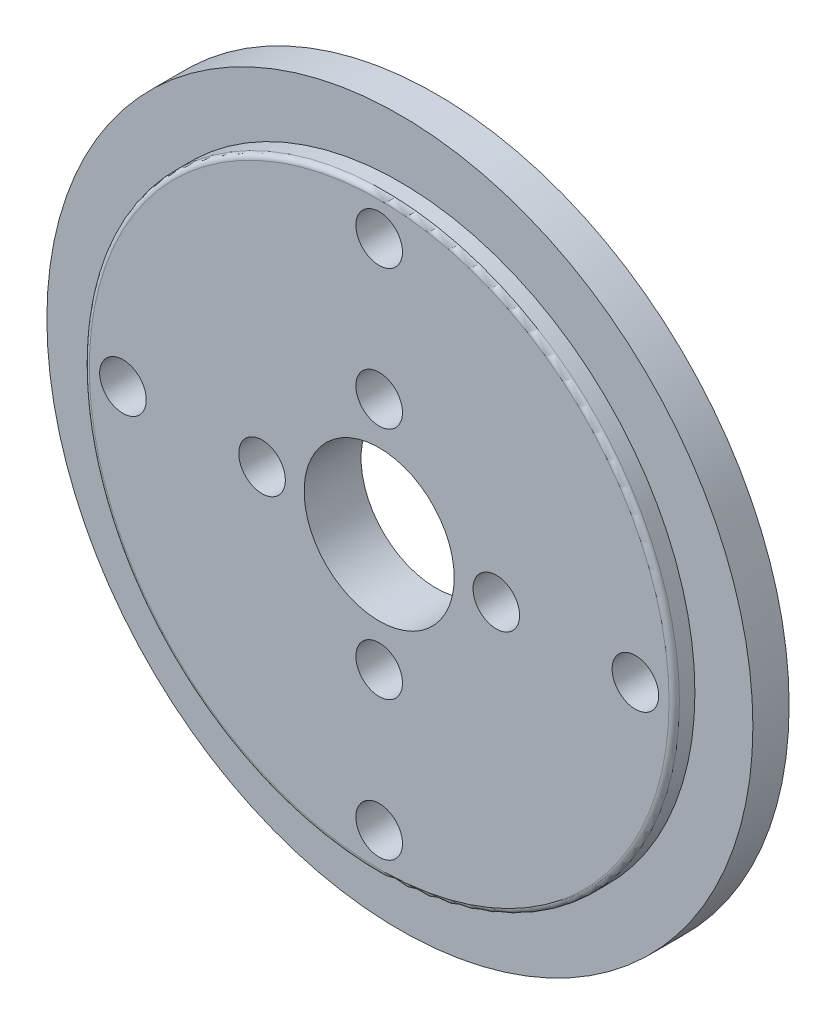
ISO-10303-21;
HEADER;
FILE_DESCRIPTION(('STEP AP214'),'2;1');
FILE_NAME('part.step','',(''),(''),'','','');
FILE_SCHEMA(('AUTOMOTIVE_DESIGN { 1 0 10303 214 1 1 1 1 }'));
ENDSEC;
DATA;
#1=APPLICATION_CONTEXT('core data for automotive mechanical design processes');
#2=APPLICATION_PROTOCOL_DEFINITION('international standard','automotive_design',2000,#1);
#3=PRODUCT_CONTEXT('',#1,'mechanical');
#4=PRODUCT('Part','Part','',(#3));
#5=PRODUCT_RELATED_PRODUCT_CATEGORY('part','',(#4));
#6=PRODUCT_DEFINITION_FORMATION('','',#4);
#7=PRODUCT_DEFINITION_CONTEXT('part definition',#1,'design');
#8=PRODUCT_DEFINITION('design','',#6,#7);
#9=PRODUCT_DEFINITION_SHAPE('','',#8);
#10=(LENGTH_UNIT() NAMED_UNIT(*) SI_UNIT(.MILLI.,.METRE.));
#11=(NAMED_UNIT(*) PLANE_ANGLE_UNIT() SI_UNIT($,.RADIAN.));
#12=(NAMED_UNIT(*) SI_UNIT($,.STERADIAN.) SOLID_ANGLE_UNIT());
#13=UNCERTAINTY_MEASURE_WITH_UNIT(LENGTH_MEASURE(1.E-05),#10,'distance_accuracy_value','');
#14=(GEOMETRIC_REPRESENTATION_CONTEXT(3) GLOBAL_UNCERTAINTY_ASSIGNED_CONTEXT((#13)) GLOBAL_UNIT_ASSIGNED_CONTEXT((#10,
#11,#12)) REPRESENTATION_CONTEXT('',''));
#15=CARTESIAN_POINT('',(0.,0.,0.));
#16=DIRECTION('',(0.,0.,1.));
#17=DIRECTION('',(1.,0.,0.));
#18=AXIS2_PLACEMENT_3D('',#15,#16,#17);
#19=CARTESIAN_POINT('',(0.,0.,1.75));
#20=DIRECTION('',(0.,0.,-1.));
#21=DIRECTION('',(-1.,0.,0.));
#22=AXIS2_PLACEMENT_3D('',#19,#20,#21);
#23=CYLINDRICAL_SURFACE('',#22,34.1);
#24=CARTESIAN_POINT('',(0.,0.,1.75));
#25=DIRECTION('',(0.,0.,1.));
#26=DIRECTION('',(1.,0.,0.));
#27=AXIS2_PLACEMENT_3D('',#24,#25,#26);
#28=CIRCLE('',#27,34.1);
#29=CARTESIAN_POINT('',(34.1,0.,1.75));
#30=VERTEX_POINT('',#29);
#31=EDGE_CURVE('E54',#30,#30,#28,.T.);
#32=ORIENTED_EDGE('',*,*,#31,.F.);
#33=EDGE_LOOP('',(#32));
#34=FACE_BOUND('',#33,.T.);
#35=CARTESIAN_POINT('',(0.,0.,-1.75));
#36=DIRECTION('',(0.,0.,1.));
#37=DIRECTION('',(1.,0.,0.));
#38=AXIS2_PLACEMENT_3D('',#35,#36,#37);
#39=CIRCLE('',#38,34.1);
#40=CARTESIAN_POINT('',(34.1,0.,-1.75));
#41=VERTEX_POINT('',#40);
#42=EDGE_CURVE('E57',#41,#41,#39,.T.);
#43=ORIENTED_EDGE('',*,*,#42,.T.);
#44=EDGE_LOOP('',(#43));
#45=FACE_BOUND('',#44,.T.);
#46=ADVANCED_FACE('F39',(#34,#45),#23,.T.);
#47=CARTESIAN_POINT('',(0.,0.,1.75));
#48=DIRECTION('',(0.,0.,1.));
#49=DIRECTION('',(1.,0.,0.));
#50=AXIS2_PLACEMENT_3D('',#47,#48,#49);
#51=PLANE('',#50);
#52=CARTESIAN_POINT('',(0.,0.,1.75));
#53=DIRECTION('',(0.,0.,1.));
#54=DIRECTION('',(1.,0.,0.));
#55=AXIS2_PLACEMENT_3D('',#52,#53,#54);
#56=CIRCLE('',#55,28.5);
#57=CARTESIAN_POINT('',(28.5,0.,1.75));
#58=VERTEX_POINT('',#57);
#59=EDGE_CURVE('E50',#58,#58,#56,.T.);
#60=ORIENTED_EDGE('',*,*,#59,.F.);
#61=EDGE_LOOP('',(#60));
#62=FACE_BOUND('',#61,.T.);
#63=ORIENTED_EDGE('',*,*,#31,.T.);
#64=EDGE_LOOP('',(#63));
#65=FACE_BOUND('',#64,.T.);
#66=ADVANCED_FACE('F136',(#62,#65),#51,.T.);
#67=CARTESIAN_POINT('',(0.,0.,-1.75));
#68=DIRECTION('',(0.,0.,1.));
#69=DIRECTION('',(1.,0.,0.));
#70=AXIS2_PLACEMENT_3D('',#67,#68,#69);
#71=PLANE('',#70);
#72=CARTESIAN_POINT('',(0.,0.,-1.75));
#73=DIRECTION('',(0.,0.,1.));
#74=DIRECTION('',(1.,0.,0.));
#75=AXIS2_PLACEMENT_3D('',#72,#73,#74);
#76=CIRCLE('',#75,7.25);
#77=CARTESIAN_POINT('',(7.25,0.,-1.75));
#78=VERTEX_POINT('',#77);
#79=EDGE_CURVE('E113',#78,#78,#76,.T.);
#80=ORIENTED_EDGE('',*,*,#79,.T.);
#81=EDGE_LOOP('',(#80));
#82=FACE_BOUND('',#81,.T.);
#83=CARTESIAN_POINT('',(0.,24.75,-1.75));
#84=DIRECTION('',(0.,0.,1.));
#85=DIRECTION('',(1.,0.,0.));
#86=AXIS2_PLACEMENT_3D('',#83,#84,#85);
#87=CIRCLE('',#86,2.25);
#88=CARTESIAN_POINT('',(2.25,24.75,-1.75));
#89=VERTEX_POINT('',#88);
#90=EDGE_CURVE('E60',#89,#89,#87,.T.);
#91=ORIENTED_EDGE('',*,*,#90,.T.);
#92=EDGE_LOOP('',(#91));
#93=FACE_BOUND('',#92,.T.);
#94=CARTESIAN_POINT('',(0.,-11.3137085,-1.75));
#95=DIRECTION('',(0.,0.,1.));
#96=DIRECTION('',(1.,0.,0.));
#97=AXIS2_PLACEMENT_3D('',#94,#95,#96);
#98=CIRCLE('',#97,2.25);
#99=CARTESIAN_POINT('',(2.25,-11.3137085,-1.75));
#100=VERTEX_POINT('',#99);
#101=EDGE_CURVE('E92',#100,#100,#98,.T.);
#102=ORIENTED_EDGE('',*,*,#101,.T.);
#103=EDGE_LOOP('',(#102));
#104=FACE_BOUND('',#103,.T.);
#105=CARTESIAN_POINT('',(-24.75,0.,-1.75));
#106=DIRECTION('',(0.,0.,1.));
#107=DIRECTION('',(1.,0.,0.));
#108=AXIS2_PLACEMENT_3D('',#105,#106,#107);
#109=CIRCLE('',#108,2.25);
#110=CARTESIAN_POINT('',(-22.5,0.,-1.75));
#111=VERTEX_POINT('',#110);
#112=EDGE_CURVE('E93',#111,#111,#109,.T.);
#113=ORIENTED_EDGE('',*,*,#112,.T.);
#114=EDGE_LOOP('',(#113));
#115=FACE_BOUND('',#114,.T.);
#116=CARTESIAN_POINT('',(-11.3137085,0.,-1.75));
#117=DIRECTION('',(0.,0.,1.));
#118=DIRECTION('',(1.,0.,0.));
#119=AXIS2_PLACEMENT_3D('',#116,#117,#118);
#120=CIRCLE('',#119,2.25);
#121=CARTESIAN_POINT('',(-9.0637085,0.,-1.75));
#122=VERTEX_POINT('',#121);
#123=EDGE_CURVE('E103',#122,#122,#120,.T.);
#124=ORIENTED_EDGE('',*,*,#123,.T.);
#125=EDGE_LOOP('',(#124));
#126=FACE_BOUND('',#125,.T.);
#127=CARTESIAN_POINT('',(0.,11.3137085,-1.75));
#128=DIRECTION('',(0.,0.,1.));
#129=DIRECTION('',(1.,0.,0.));
#130=AXIS2_PLACEMENT_3D('',#127,#128,#129);
#131=CIRCLE('',#130,2.25);
#132=CARTESIAN_POINT('',(2.25,11.3137085,-1.75));
#133=VERTEX_POINT('',#132);
#134=EDGE_CURVE('E66',#133,#133,#131,.T.);
#135=ORIENTED_EDGE('',*,*,#134,.T.);
#136=EDGE_LOOP('',(#135));
#137=FACE_BOUND('',#136,.T.);
#138=CARTESIAN_POINT('',(24.75,0.,-1.75));
#139=DIRECTION('',(0.,0.,1.));
#140=DIRECTION('',(1.,0.,0.));
#141=AXIS2_PLACEMENT_3D('',#138,#139,#140);
#142=CIRCLE('',#141,2.25);
#143=CARTESIAN_POINT('',(27.,0.,-1.75));
#144=VERTEX_POINT('',#143);
#145=EDGE_CURVE('E67',#144,#144,#142,.T.);
#146=ORIENTED_EDGE('',*,*,#145,.T.);
#147=EDGE_LOOP('',(#146));
#148=FACE_BOUND('',#147,.T.);
#149=CARTESIAN_POINT('',(11.3137085,0.,-1.75));
#150=DIRECTION('',(0.,0.,1.));
#151=DIRECTION('',(1.,0.,0.));
#152=AXIS2_PLACEMENT_3D('',#149,#150,#151);
#153=CIRCLE('',#152,2.25);
#154=CARTESIAN_POINT('',(13.5637085,0.,-1.75));
#155=VERTEX_POINT('',#154);
#156=EDGE_CURVE('E80',#155,#155,#153,.T.);
#157=ORIENTED_EDGE('',*,*,#156,.T.);
#158=EDGE_LOOP('',(#157));
#159=FACE_BOUND('',#158,.T.);
#160=CARTESIAN_POINT('',(0.,-24.75,-1.75));
#161=DIRECTION('',(0.,0.,1.));
#162=DIRECTION('',(1.,0.,0.));
#163=AXIS2_PLACEMENT_3D('',#160,#161,#162);
#164=CIRCLE('',#163,2.25);
#165=CARTESIAN_POINT('',(2.25,-24.75,-1.75));
#166=VERTEX_POINT('',#165);
#167=EDGE_CURVE('E81',#166,#166,#164,.T.);
#168=ORIENTED_EDGE('',*,*,#167,.T.);
#169=EDGE_LOOP('',(#168));
#170=FACE_BOUND('',#169,.T.);
#171=ORIENTED_EDGE('',*,*,#42,.F.);
#172=EDGE_LOOP('',(#171));
#173=FACE_BOUND('',#172,.T.);
#174=ADVANCED_FACE('F117',(#82,#93,#104,#115,#126,#137,#148,#159,#170,#173),#71,.F.);
#175=CARTESIAN_POINT('',(0.,0.,3.75));
#176=DIRECTION('',(0.,0.,-1.));
#177=DIRECTION('',(-1.,0.,0.));
#178=AXIS2_PLACEMENT_3D('',#175,#176,#177);
#179=CYLINDRICAL_SURFACE('',#178,28.5);
#180=CARTESIAN_POINT('',(0.,0.,3.25));
#181=DIRECTION('',(0.,0.,1.));
#182=DIRECTION('',(1.,0.,0.));
#183=AXIS2_PLACEMENT_3D('',#180,#181,#182);
#184=CIRCLE('',#183,28.5);
#185=CARTESIAN_POINT('',(28.5,0.,3.25));
#186=VERTEX_POINT('',#185);
#187=EDGE_CURVE('E10',#186,#186,#184,.F.);
#188=ORIENTED_EDGE('',*,*,#187,.T.);
#189=EDGE_LOOP('',(#188));
#190=FACE_BOUND('',#189,.T.);
#191=ORIENTED_EDGE('',*,*,#59,.T.);
#192=EDGE_LOOP('',(#191));
#193=FACE_BOUND('',#192,.T.);
#194=ADVANCED_FACE('F146',(#190,#193),#179,.T.);
#195=CARTESIAN_POINT('',(0.,0.,3.75));
#196=DIRECTION('',(0.,0.,1.));
#197=DIRECTION('',(1.,0.,0.));
#198=AXIS2_PLACEMENT_3D('',#195,#196,#197);
#199=PLANE('',#198);
#200=CARTESIAN_POINT('',(0.,0.,3.75));
#201=DIRECTION('',(0.,0.,1.));
#202=DIRECTION('',(1.,0.,0.));
#203=AXIS2_PLACEMENT_3D('',#200,#201,#202);
#204=CIRCLE('',#203,28.);
#205=CARTESIAN_POINT('',(28.,0.,3.75));
#206=VERTEX_POINT('',#205);
#207=EDGE_CURVE('E46',#206,#206,#204,.T.);
#208=ORIENTED_EDGE('',*,*,#207,.T.);
#209=EDGE_LOOP('',(#208));
#210=FACE_BOUND('',#209,.T.);
#211=CARTESIAN_POINT('',(0.,0.,3.75));
#212=DIRECTION('',(0.,0.,1.));
#213=DIRECTION('',(1.,0.,0.));
#214=AXIS2_PLACEMENT_3D('',#211,#212,#213);
#215=CIRCLE('',#214,7.25);
#216=CARTESIAN_POINT('',(7.25,0.,3.75));
#217=VERTEX_POINT('',#216);
#218=EDGE_CURVE('E106',#217,#217,#215,.T.);
#219=ORIENTED_EDGE('',*,*,#218,.F.);
#220=EDGE_LOOP('',(#219));
#221=FACE_BOUND('',#220,.T.);
#222=CARTESIAN_POINT('',(0.,24.75,3.75));
#223=DIRECTION('',(0.,0.,1.));
#224=DIRECTION('',(1.,0.,0.));
#225=AXIS2_PLACEMENT_3D('',#222,#223,#224);
#226=CIRCLE('',#225,2.25);
#227=CARTESIAN_POINT('',(2.25,24.75,3.75));
#228=VERTEX_POINT('',#227);
#229=EDGE_CURVE('E74',#228,#228,#226,.T.);
#230=ORIENTED_EDGE('',*,*,#229,.F.);
#231=EDGE_LOOP('',(#230));
#232=FACE_BOUND('',#231,.T.);
#233=CARTESIAN_POINT('',(0.,-11.3137085,3.75));
#234=DIRECTION('',(0.,0.,1.));
#235=DIRECTION('',(1.,0.,0.));
#236=AXIS2_PLACEMENT_3D('',#233,#234,#235);
#237=CIRCLE('',#236,2.25);
#238=CARTESIAN_POINT('',(2.25,-11.3137085,3.75));
#239=VERTEX_POINT('',#238);
#240=EDGE_CURVE('E84',#239,#239,#237,.T.);
#241=ORIENTED_EDGE('',*,*,#240,.F.);
#242=EDGE_LOOP('',(#241));
#243=FACE_BOUND('',#242,.T.);
#244=CARTESIAN_POINT('',(-24.75,0.,3.75));
#245=DIRECTION('',(0.,0.,1.));
#246=DIRECTION('',(1.,0.,0.));
#247=AXIS2_PLACEMENT_3D('',#244,#245,#246);
#248=CIRCLE('',#247,2.25);
#249=CARTESIAN_POINT('',(-22.5,0.,3.75));
#250=VERTEX_POINT('',#249);
#251=EDGE_CURVE('E89',#250,#250,#248,.T.);
#252=ORIENTED_EDGE('',*,*,#251,.F.);
#253=EDGE_LOOP('',(#252));
#254=FACE_BOUND('',#253,.T.);
#255=CARTESIAN_POINT('',(-11.3137085,0.,3.75));
#256=DIRECTION('',(0.,0.,1.));
#257=DIRECTION('',(1.,0.,0.));
#258=AXIS2_PLACEMENT_3D('',#255,#256,#257);
#259=CIRCLE('',#258,2.25);
#260=CARTESIAN_POINT('',(-9.0637085,0.,3.75));
#261=VERTEX_POINT('',#260);
#262=EDGE_CURVE('E96',#261,#261,#259,.T.);
#263=ORIENTED_EDGE('',*,*,#262,.F.);
#264=EDGE_LOOP('',(#263));
#265=FACE_BOUND('',#264,.T.);
#266=CARTESIAN_POINT('',(0.,11.3137085,3.75));
#267=DIRECTION('',(0.,0.,1.));
#268=DIRECTION('',(1.,0.,0.));
#269=AXIS2_PLACEMENT_3D('',#266,#267,#268);
#270=CIRCLE('',#269,2.25);
#271=CARTESIAN_POINT('',(2.25,11.3137085,3.75));
#272=VERTEX_POINT('',#271);
#273=EDGE_CURVE('E71',#272,#272,#270,.T.);
#274=ORIENTED_EDGE('',*,*,#273,.F.);
#275=EDGE_LOOP('',(#274));
#276=FACE_BOUND('',#275,.T.);
#277=CARTESIAN_POINT('',(24.75,0.,3.75));
#278=DIRECTION('',(0.,0.,1.));
#279=DIRECTION('',(1.,0.,0.));
#280=AXIS2_PLACEMENT_3D('',#277,#278,#279);
#281=CIRCLE('',#280,2.25);
#282=CARTESIAN_POINT('',(27.,0.,3.75));
#283=VERTEX_POINT('',#282);
#284=EDGE_CURVE('E63',#283,#283,#281,.T.);
#285=ORIENTED_EDGE('',*,*,#284,.F.);
#286=EDGE_LOOP('',(#285));
#287=FACE_BOUND('',#286,.T.);
#288=CARTESIAN_POINT('',(11.3137085,0.,3.75));
#289=DIRECTION('',(0.,0.,1.));
#290=DIRECTION('',(1.,0.,0.));
#291=AXIS2_PLACEMENT_3D('',#288,#289,#290);
#292=CIRCLE('',#291,2.25);
#293=CARTESIAN_POINT('',(13.5637085,0.,3.75));
#294=VERTEX_POINT('',#293);
#295=EDGE_CURVE('E70',#294,#294,#292,.T.);
#296=ORIENTED_EDGE('',*,*,#295,.F.);
#297=EDGE_LOOP('',(#296));
#298=FACE_BOUND('',#297,.T.);
#299=CARTESIAN_POINT('',(0.,-24.75,3.75));
#300=DIRECTION('',(0.,0.,1.));
#301=DIRECTION('',(1.,0.,0.));
#302=AXIS2_PLACEMENT_3D('',#299,#300,#301);
#303=CIRCLE('',#302,2.25);
#304=CARTESIAN_POINT('',(2.25,-24.75,3.75));
#305=VERTEX_POINT('',#304);
#306=EDGE_CURVE('E77',#305,#305,#303,.T.);
#307=ORIENTED_EDGE('',*,*,#306,.F.);
#308=EDGE_LOOP('',(#307));
#309=FACE_BOUND('',#308,.T.);
#310=ADVANCED_FACE('F149',(#210,#221,#232,#243,#254,#265,#276,#287,#298,#309),#199,.T.);
#311=CARTESIAN_POINT('',(0.,-24.75,-1.75));
#312=DIRECTION('',(0.,0.,1.));
#313=DIRECTION('',(1.,0.,0.));
#314=AXIS2_PLACEMENT_3D('',#311,#312,#313);
#315=CYLINDRICAL_SURFACE('',#314,2.25);
#316=ORIENTED_EDGE('',*,*,#167,.F.);
#317=EDGE_LOOP('',(#316));
#318=FACE_BOUND('',#317,.T.);
#319=ORIENTED_EDGE('',*,*,#306,.T.);
#320=EDGE_LOOP('',(#319));
#321=FACE_BOUND('',#320,.T.);
#322=ADVANCED_FACE('F152',(#318,#321),#315,.F.);
#323=CARTESIAN_POINT('',(11.3137085,0.,-1.75));
#324=DIRECTION('',(0.,0.,1.));
#325=DIRECTION('',(1.,0.,0.));
#326=AXIS2_PLACEMENT_3D('',#323,#324,#325);
#327=CYLINDRICAL_SURFACE('',#326,2.25);
#328=ORIENTED_EDGE('',*,*,#156,.F.);
#329=EDGE_LOOP('',(#328));
#330=FACE_BOUND('',#329,.T.);
#331=ORIENTED_EDGE('',*,*,#295,.T.);
#332=EDGE_LOOP('',(#331));
#333=FACE_BOUND('',#332,.T.);
#334=ADVANCED_FACE('F157',(#330,#333),#327,.F.);
#335=CARTESIAN_POINT('',(24.75,0.,-1.75));
#336=DIRECTION('',(0.,0.,1.));
#337=DIRECTION('',(1.,0.,0.));
#338=AXIS2_PLACEMENT_3D('',#335,#336,#337);
#339=CYLINDRICAL_SURFACE('',#338,2.25);
#340=ORIENTED_EDGE('',*,*,#145,.F.);
#341=EDGE_LOOP('',(#340));
#342=FACE_BOUND('',#341,.T.);
#343=ORIENTED_EDGE('',*,*,#284,.T.);
#344=EDGE_LOOP('',(#343));
#345=FACE_BOUND('',#344,.T.);
#346=ADVANCED_FACE('F153',(#342,#345),#339,.F.);
#347=CARTESIAN_POINT('',(0.,11.3137085,-1.75));
#348=DIRECTION('',(0.,0.,1.));
#349=DIRECTION('',(1.,0.,0.));
#350=AXIS2_PLACEMENT_3D('',#347,#348,#349);
#351=CYLINDRICAL_SURFACE('',#350,2.25);
#352=ORIENTED_EDGE('',*,*,#134,.F.);
#353=EDGE_LOOP('',(#352));
#354=FACE_BOUND('',#353,.T.);
#355=ORIENTED_EDGE('',*,*,#273,.T.);
#356=EDGE_LOOP('',(#355));
#357=FACE_BOUND('',#356,.T.);
#358=ADVANCED_FACE('F156',(#354,#357),#351,.F.);
#359=CARTESIAN_POINT('',(-11.3137085,0.,-1.75));
#360=DIRECTION('',(0.,0.,1.));
#361=DIRECTION('',(1.,0.,0.));
#362=AXIS2_PLACEMENT_3D('',#359,#360,#361);
#363=CYLINDRICAL_SURFACE('',#362,2.25);
#364=ORIENTED_EDGE('',*,*,#123,.F.);
#365=EDGE_LOOP('',(#364));
#366=FACE_BOUND('',#365,.T.);
#367=ORIENTED_EDGE('',*,*,#262,.T.);
#368=EDGE_LOOP('',(#367));
#369=FACE_BOUND('',#368,.T.);
#370=ADVANCED_FACE('F161',(#366,#369),#363,.F.);
#371=CARTESIAN_POINT('',(-24.75,0.,-1.75));
#372=DIRECTION('',(0.,0.,1.));
#373=DIRECTION('',(1.,0.,0.));
#374=AXIS2_PLACEMENT_3D('',#371,#372,#373);
#375=CYLINDRICAL_SURFACE('',#374,2.25);
#376=ORIENTED_EDGE('',*,*,#112,.F.);
#377=EDGE_LOOP('',(#376));
#378=FACE_BOUND('',#377,.T.);
#379=ORIENTED_EDGE('',*,*,#251,.T.);
#380=EDGE_LOOP('',(#379));
#381=FACE_BOUND('',#380,.T.);
#382=ADVANCED_FACE('F169',(#378,#381),#375,.F.);
#383=CARTESIAN_POINT('',(0.,-11.3137085,-1.75));
#384=DIRECTION('',(0.,0.,1.));
#385=DIRECTION('',(1.,0.,0.));
#386=AXIS2_PLACEMENT_3D('',#383,#384,#385);
#387=CYLINDRICAL_SURFACE('',#386,2.25);
#388=ORIENTED_EDGE('',*,*,#101,.F.);
#389=EDGE_LOOP('',(#388));
#390=FACE_BOUND('',#389,.T.);
#391=ORIENTED_EDGE('',*,*,#240,.T.);
#392=EDGE_LOOP('',(#391));
#393=FACE_BOUND('',#392,.T.);
#394=ADVANCED_FACE('F132',(#390,#393),#387,.F.);
#395=CARTESIAN_POINT('',(0.,24.75,-1.75));
#396=DIRECTION('',(0.,0.,1.));
#397=DIRECTION('',(1.,0.,0.));
#398=AXIS2_PLACEMENT_3D('',#395,#396,#397);
#399=CYLINDRICAL_SURFACE('',#398,2.25);
#400=ORIENTED_EDGE('',*,*,#90,.F.);
#401=EDGE_LOOP('',(#400));
#402=FACE_BOUND('',#401,.T.);
#403=ORIENTED_EDGE('',*,*,#229,.T.);
#404=EDGE_LOOP('',(#403));
#405=FACE_BOUND('',#404,.T.);
#406=ADVANCED_FACE('F122',(#402,#405),#399,.F.);
#407=CARTESIAN_POINT('',(0.,0.,3.75));
#408=DIRECTION('',(0.,0.,-1.));
#409=DIRECTION('',(-1.,0.,0.));
#410=AXIS2_PLACEMENT_3D('',#407,#408,#409);
#411=CYLINDRICAL_SURFACE('',#410,7.25);
#412=ORIENTED_EDGE('',*,*,#218,.T.);
#413=EDGE_LOOP('',(#412));
#414=FACE_BOUND('',#413,.T.);
#415=ORIENTED_EDGE('',*,*,#79,.F.);
#416=EDGE_LOOP('',(#415));
#417=FACE_BOUND('',#416,.T.);
#418=ADVANCED_FACE('F120',(#414,#417),#411,.F.);
#419=CARTESIAN_POINT('',(0.,0.,3.25));
#420=DIRECTION('',(0.,0.,1.));
#421=DIRECTION('',(1.,0.,0.));
#422=AXIS2_PLACEMENT_3D('',#419,#420,#421);
#423=TOROIDAL_SURFACE('',#422,28.,0.5);
#424=ORIENTED_EDGE('',*,*,#187,.F.);
#425=EDGE_LOOP('',(#424));
#426=FACE_BOUND('',#425,.T.);
#427=ORIENTED_EDGE('',*,*,#207,.F.);
#428=EDGE_LOOP('',(#427));
#429=FACE_BOUND('',#428,.T.);
#430=ADVANCED_FACE('F41',(#426,#429),#423,.T.);
#431=CLOSED_SHELL('',(#46,#66,#174,#194,#310,#322,#334,#346,#358,#370,#382,#394,#406,#418,#430));
#432=MANIFOLD_SOLID_BREP('B2',#431);
#433=ADVANCED_BREP_SHAPE_REPRESENTATION('',(#18,#432),#14);
#434=SHAPE_DEFINITION_REPRESENTATION(#9,#433);
ENDSEC;
END-ISO-10303-21;
